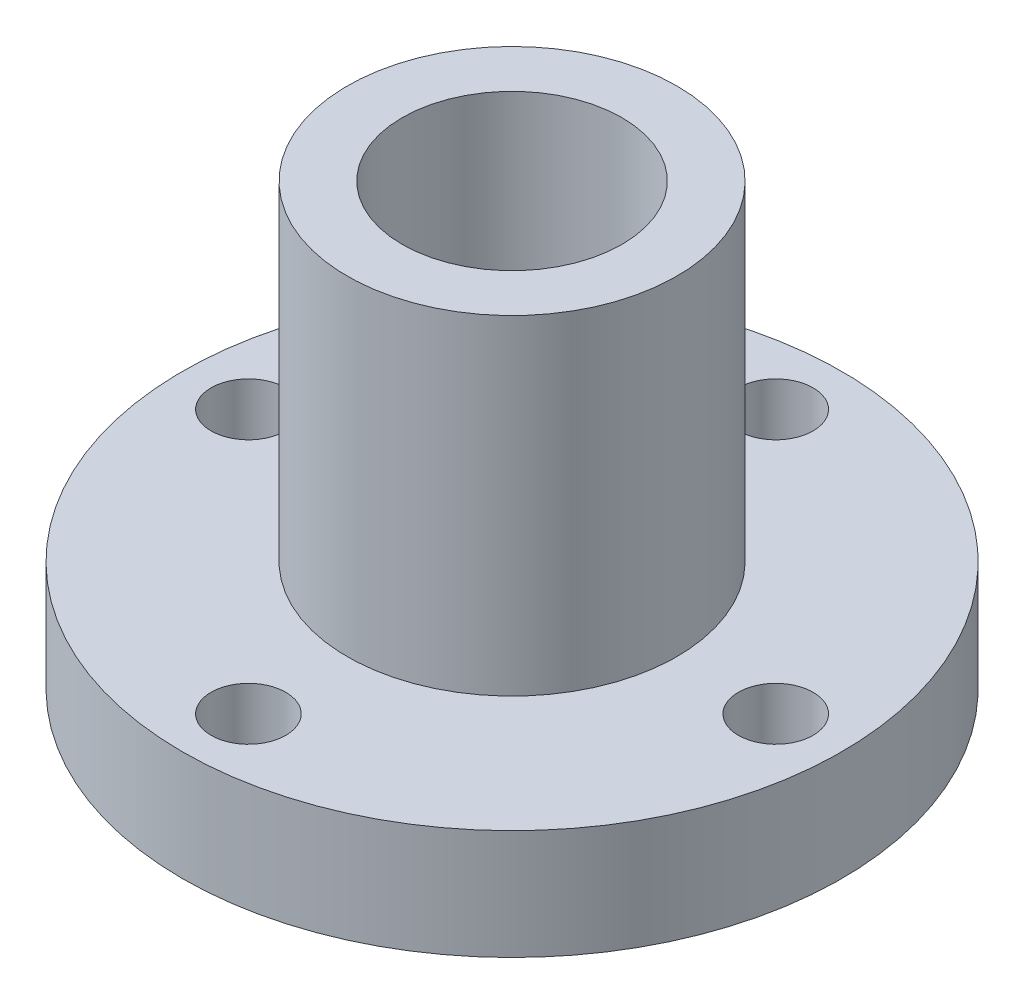
ISO-10303-21;
HEADER;
FILE_DESCRIPTION(('STEP AP214'),'2;1');
FILE_NAME('part.step','',(''),(''),'','','');
FILE_SCHEMA(('AUTOMOTIVE_DESIGN { 1 0 10303 214 1 1 1 1 }'));
ENDSEC;
DATA;
#1=APPLICATION_CONTEXT('core data for automotive mechanical design processes');
#2=APPLICATION_PROTOCOL_DEFINITION('international standard','automotive_design',2000,#1);
#3=PRODUCT_CONTEXT('',#1,'mechanical');
#4=PRODUCT('Part','Part','',(#3));
#5=PRODUCT_RELATED_PRODUCT_CATEGORY('part','',(#4));
#6=PRODUCT_DEFINITION_FORMATION('','',#4);
#7=PRODUCT_DEFINITION_CONTEXT('part definition',#1,'design');
#8=PRODUCT_DEFINITION('design','',#6,#7);
#9=PRODUCT_DEFINITION_SHAPE('','',#8);
#10=(LENGTH_UNIT() NAMED_UNIT(*) SI_UNIT(.MILLI.,.METRE.));
#11=(NAMED_UNIT(*) PLANE_ANGLE_UNIT() SI_UNIT($,.RADIAN.));
#12=(NAMED_UNIT(*) SI_UNIT($,.STERADIAN.) SOLID_ANGLE_UNIT());
#13=UNCERTAINTY_MEASURE_WITH_UNIT(LENGTH_MEASURE(1.E-05),#10,'distance_accuracy_value','');
#14=(GEOMETRIC_REPRESENTATION_CONTEXT(3) GLOBAL_UNCERTAINTY_ASSIGNED_CONTEXT((#13)) GLOBAL_UNIT_ASSIGNED_CONTEXT((#10,
#11,#12)) REPRESENTATION_CONTEXT('',''));
#15=CARTESIAN_POINT('',(0.,0.,0.));
#16=DIRECTION('',(0.,0.,1.));
#17=DIRECTION('',(1.,0.,0.));
#18=AXIS2_PLACEMENT_3D('',#15,#16,#17);
#19=CARTESIAN_POINT('',(0.,6.35,0.));
#20=DIRECTION('',(0.,1.,0.));
#21=DIRECTION('',(0.,0.,1.));
#22=AXIS2_PLACEMENT_3D('',#19,#20,#21);
#23=PLANE('',#22);
#24=CARTESIAN_POINT('',(0.,6.35,-15.24));
#25=DIRECTION('',(0.,1.,0.));
#26=DIRECTION('',(0.,0.,1.));
#27=AXIS2_PLACEMENT_3D('',#24,#25,#26);
#28=CIRCLE('',#27,2.159);
#29=CARTESIAN_POINT('',(0.,6.35,-13.081));
#30=VERTEX_POINT('',#29);
#31=EDGE_CURVE('E59',#30,#30,#28,.T.);
#32=ORIENTED_EDGE('',*,*,#31,.F.);
#33=EDGE_LOOP('',(#32));
#34=FACE_BOUND('',#33,.T.);
#35=CARTESIAN_POINT('',(15.24,6.35,0.));
#36=DIRECTION('',(0.,1.,0.));
#37=DIRECTION('',(0.,0.,1.));
#38=AXIS2_PLACEMENT_3D('',#35,#36,#37);
#39=CIRCLE('',#38,2.159);
#40=CARTESIAN_POINT('',(15.24,6.35,2.159));
#41=VERTEX_POINT('',#40);
#42=EDGE_CURVE('E113',#41,#41,#39,.T.);
#43=ORIENTED_EDGE('',*,*,#42,.F.);
#44=EDGE_LOOP('',(#43));
#45=FACE_BOUND('',#44,.T.);
#46=CARTESIAN_POINT('',(0.,6.35,15.24));
#47=DIRECTION('',(0.,1.,0.));
#48=DIRECTION('',(0.,0.,1.));
#49=AXIS2_PLACEMENT_3D('',#46,#47,#48);
#50=CIRCLE('',#49,2.159);
#51=CARTESIAN_POINT('',(0.,6.35,17.399));
#52=VERTEX_POINT('',#51);
#53=EDGE_CURVE('E117',#52,#52,#50,.T.);
#54=ORIENTED_EDGE('',*,*,#53,.F.);
#55=EDGE_LOOP('',(#54));
#56=FACE_BOUND('',#55,.T.);
#57=CARTESIAN_POINT('',(-15.24,6.35,0.));
#58=DIRECTION('',(0.,1.,0.));
#59=DIRECTION('',(0.,0.,1.));
#60=AXIS2_PLACEMENT_3D('',#57,#58,#59);
#61=CIRCLE('',#60,2.159);
#62=CARTESIAN_POINT('',(-15.24,6.35,2.159));
#63=VERTEX_POINT('',#62);
#64=EDGE_CURVE('E78',#63,#63,#61,.T.);
#65=ORIENTED_EDGE('',*,*,#64,.F.);
#66=EDGE_LOOP('',(#65));
#67=FACE_BOUND('',#66,.T.);
#68=CARTESIAN_POINT('',(0.,6.35,0.));
#69=DIRECTION('',(0.,1.,0.));
#70=DIRECTION('',(0.,0.,1.));
#71=AXIS2_PLACEMENT_3D('',#68,#69,#70);
#72=CIRCLE('',#71,19.05);
#73=CARTESIAN_POINT('',(0.,6.35,19.05));
#74=VERTEX_POINT('',#73);
#75=EDGE_CURVE('E10',#74,#74,#72,.T.);
#76=ORIENTED_EDGE('',*,*,#75,.T.);
#77=EDGE_LOOP('',(#76));
#78=FACE_BOUND('',#77,.T.);
#79=CARTESIAN_POINT('',(0.,6.35,0.));
#80=DIRECTION('',(0.,1.,0.));
#81=DIRECTION('',(0.,0.,1.));
#82=AXIS2_PLACEMENT_3D('',#79,#80,#81);
#83=CIRCLE('',#82,9.525);
#84=CARTESIAN_POINT('',(0.,6.35,-9.525));
#85=VERTEX_POINT('',#84);
#86=EDGE_CURVE('E70',#85,#85,#83,.T.);
#87=ORIENTED_EDGE('',*,*,#86,.F.);
#88=EDGE_LOOP('',(#87));
#89=FACE_BOUND('',#88,.T.);
#90=ADVANCED_FACE('F37',(#34,#45,#56,#67,#78,#89),#23,.T.);
#91=CARTESIAN_POINT('',(0.,0.,0.));
#92=DIRECTION('',(0.,1.,0.));
#93=DIRECTION('',(0.,0.,1.));
#94=AXIS2_PLACEMENT_3D('',#91,#92,#93);
#95=PLANE('',#94);
#96=CARTESIAN_POINT('',(0.,0.,-15.24));
#97=DIRECTION('',(0.,1.,0.));
#98=DIRECTION('',(0.,0.,1.));
#99=AXIS2_PLACEMENT_3D('',#96,#97,#98);
#100=CIRCLE('',#99,2.159);
#101=CARTESIAN_POINT('',(0.,0.,-13.081));
#102=VERTEX_POINT('',#101);
#103=EDGE_CURVE('E41',#102,#102,#100,.T.);
#104=ORIENTED_EDGE('',*,*,#103,.T.);
#105=EDGE_LOOP('',(#104));
#106=FACE_BOUND('',#105,.T.);
#107=CARTESIAN_POINT('',(15.24,0.,0.));
#108=DIRECTION('',(0.,1.,0.));
#109=DIRECTION('',(0.,0.,1.));
#110=AXIS2_PLACEMENT_3D('',#107,#108,#109);
#111=CIRCLE('',#110,2.159);
#112=CARTESIAN_POINT('',(15.24,0.,2.159));
#113=VERTEX_POINT('',#112);
#114=EDGE_CURVE('E61',#113,#113,#111,.T.);
#115=ORIENTED_EDGE('',*,*,#114,.T.);
#116=EDGE_LOOP('',(#115));
#117=FACE_BOUND('',#116,.T.);
#118=CARTESIAN_POINT('',(0.,0.,15.24));
#119=DIRECTION('',(0.,1.,0.));
#120=DIRECTION('',(0.,0.,1.));
#121=AXIS2_PLACEMENT_3D('',#118,#119,#120);
#122=CIRCLE('',#121,2.159);
#123=CARTESIAN_POINT('',(0.,0.,17.399));
#124=VERTEX_POINT('',#123);
#125=EDGE_CURVE('E58',#124,#124,#122,.T.);
#126=ORIENTED_EDGE('',*,*,#125,.T.);
#127=EDGE_LOOP('',(#126));
#128=FACE_BOUND('',#127,.T.);
#129=CARTESIAN_POINT('',(-15.24,0.,0.));
#130=DIRECTION('',(0.,1.,0.));
#131=DIRECTION('',(0.,0.,1.));
#132=AXIS2_PLACEMENT_3D('',#129,#130,#131);
#133=CIRCLE('',#132,2.159);
#134=CARTESIAN_POINT('',(-15.24,0.,2.159));
#135=VERTEX_POINT('',#134);
#136=EDGE_CURVE('E55',#135,#135,#133,.T.);
#137=ORIENTED_EDGE('',*,*,#136,.T.);
#138=EDGE_LOOP('',(#137));
#139=FACE_BOUND('',#138,.T.);
#140=CARTESIAN_POINT('',(0.,0.,0.));
#141=DIRECTION('',(0.,1.,0.));
#142=DIRECTION('',(0.,0.,1.));
#143=AXIS2_PLACEMENT_3D('',#140,#141,#142);
#144=CIRCLE('',#143,19.05);
#145=CARTESIAN_POINT('',(0.,0.,19.05));
#146=VERTEX_POINT('',#145);
#147=EDGE_CURVE('E45',#146,#146,#144,.T.);
#148=ORIENTED_EDGE('',*,*,#147,.F.);
#149=EDGE_LOOP('',(#148));
#150=FACE_BOUND('',#149,.T.);
#151=CARTESIAN_POINT('',(0.,0.,0.));
#152=DIRECTION('',(0.,1.,0.));
#153=DIRECTION('',(0.,0.,1.));
#154=AXIS2_PLACEMENT_3D('',#151,#152,#153);
#155=CIRCLE('',#154,6.35);
#156=CARTESIAN_POINT('',(0.,0.,6.35));
#157=VERTEX_POINT('',#156);
#158=EDGE_CURVE('E50',#157,#157,#155,.T.);
#159=ORIENTED_EDGE('',*,*,#158,.T.);
#160=EDGE_LOOP('',(#159));
#161=FACE_BOUND('',#160,.T.);
#162=ADVANCED_FACE('F86',(#106,#117,#128,#139,#150,#161),#95,.F.);
#163=CARTESIAN_POINT('',(0.,6.35,0.));
#164=DIRECTION('',(0.,-1.,0.));
#165=DIRECTION('',(0.,0.,-1.));
#166=AXIS2_PLACEMENT_3D('',#163,#164,#165);
#167=CYLINDRICAL_SURFACE('',#166,19.05);
#168=ORIENTED_EDGE('',*,*,#75,.F.);
#169=EDGE_LOOP('',(#168));
#170=FACE_BOUND('',#169,.T.);
#171=ORIENTED_EDGE('',*,*,#147,.T.);
#172=EDGE_LOOP('',(#171));
#173=FACE_BOUND('',#172,.T.);
#174=ADVANCED_FACE('F39',(#170,#173),#167,.T.);
#175=CARTESIAN_POINT('',(0.,6.35,0.));
#176=DIRECTION('',(0.,-1.,0.));
#177=DIRECTION('',(0.,0.,-1.));
#178=AXIS2_PLACEMENT_3D('',#175,#176,#177);
#179=CYLINDRICAL_SURFACE('',#178,6.35);
#180=ORIENTED_EDGE('',*,*,#158,.F.);
#181=EDGE_LOOP('',(#180));
#182=FACE_BOUND('',#181,.T.);
#183=CARTESIAN_POINT('',(0.,25.4,0.));
#184=DIRECTION('',(0.,1.,0.));
#185=DIRECTION('',(0.,0.,1.));
#186=AXIS2_PLACEMENT_3D('',#183,#184,#185);
#187=CIRCLE('',#186,6.35);
#188=CARTESIAN_POINT('',(0.,25.4,6.35));
#189=VERTEX_POINT('',#188);
#190=EDGE_CURVE('E66',#189,#189,#187,.T.);
#191=ORIENTED_EDGE('',*,*,#190,.T.);
#192=EDGE_LOOP('',(#191));
#193=FACE_BOUND('',#192,.T.);
#194=ADVANCED_FACE('F88',(#182,#193),#179,.F.);
#195=CARTESIAN_POINT('',(0.,25.4,0.));
#196=DIRECTION('',(0.,1.,0.));
#197=DIRECTION('',(0.,0.,1.));
#198=AXIS2_PLACEMENT_3D('',#195,#196,#197);
#199=PLANE('',#198);
#200=CARTESIAN_POINT('',(0.,25.4,0.));
#201=DIRECTION('',(0.,1.,0.));
#202=DIRECTION('',(0.,0.,1.));
#203=AXIS2_PLACEMENT_3D('',#200,#201,#202);
#204=CIRCLE('',#203,9.525);
#205=CARTESIAN_POINT('',(0.,25.4,-9.525));
#206=VERTEX_POINT('',#205);
#207=EDGE_CURVE('E75',#206,#206,#204,.T.);
#208=ORIENTED_EDGE('',*,*,#207,.T.);
#209=EDGE_LOOP('',(#208));
#210=FACE_BOUND('',#209,.T.);
#211=ORIENTED_EDGE('',*,*,#190,.F.);
#212=EDGE_LOOP('',(#211));
#213=FACE_BOUND('',#212,.T.);
#214=ADVANCED_FACE('F90',(#210,#213),#199,.T.);
#215=CARTESIAN_POINT('',(0.,25.4,0.));
#216=DIRECTION('',(0.,-1.,0.));
#217=DIRECTION('',(0.,0.,-1.));
#218=AXIS2_PLACEMENT_3D('',#215,#216,#217);
#219=CYLINDRICAL_SURFACE('',#218,9.525);
#220=CARTESIAN_POINT('',(0.,25.4,-9.525));
#221=CARTESIAN_POINT('',(0.,25.2015625,-9.525));
#222=CARTESIAN_POINT('',(0.,25.003125,-9.525));
#223=CARTESIAN_POINT('',(0.,24.60625,-9.525));
#224=CARTESIAN_POINT('',(0.,24.4078125,-9.525));
#225=CARTESIAN_POINT('',(0.,24.0109375,-9.525));
#226=CARTESIAN_POINT('',(0.,23.8125,-9.525));
#227=CARTESIAN_POINT('',(0.,23.415625,-9.525));
#228=CARTESIAN_POINT('',(0.,23.2171875,-9.525));
#229=CARTESIAN_POINT('',(0.,22.8203125,-9.525));
#230=CARTESIAN_POINT('',(0.,22.621875,-9.525));
#231=CARTESIAN_POINT('',(0.,22.225,-9.525));
#232=CARTESIAN_POINT('',(0.,22.0265625,-9.525));
#233=CARTESIAN_POINT('',(0.,21.6296875,-9.525));
#234=CARTESIAN_POINT('',(0.,21.43125,-9.525));
#235=CARTESIAN_POINT('',(0.,21.034375,-9.525));
#236=CARTESIAN_POINT('',(0.,20.8359375,-9.525));
#237=CARTESIAN_POINT('',(0.,20.4390625,-9.525));
#238=CARTESIAN_POINT('',(0.,20.240625,-9.525));
#239=CARTESIAN_POINT('',(0.,19.84375,-9.525));
#240=CARTESIAN_POINT('',(0.,19.6453125,-9.525));
#241=CARTESIAN_POINT('',(0.,19.2484375,-9.525));
#242=CARTESIAN_POINT('',(0.,19.05,-9.525));
#243=CARTESIAN_POINT('',(0.,18.653125,-9.525));
#244=CARTESIAN_POINT('',(0.,18.4546875,-9.525));
#245=CARTESIAN_POINT('',(0.,18.0578125,-9.525));
#246=CARTESIAN_POINT('',(0.,17.859375,-9.525));
#247=CARTESIAN_POINT('',(0.,17.4625,-9.525));
#248=CARTESIAN_POINT('',(0.,17.2640625,-9.525));
#249=CARTESIAN_POINT('',(0.,16.8671875,-9.525));
#250=CARTESIAN_POINT('',(0.,16.66875,-9.525));
#251=CARTESIAN_POINT('',(0.,16.271875,-9.525));
#252=CARTESIAN_POINT('',(0.,16.0734375,-9.525));
#253=CARTESIAN_POINT('',(0.,15.6765625,-9.525));
#254=CARTESIAN_POINT('',(0.,15.478125,-9.525));
#255=CARTESIAN_POINT('',(0.,15.08125,-9.525));
#256=CARTESIAN_POINT('',(0.,14.8828125,-9.525));
#257=CARTESIAN_POINT('',(0.,14.4859375,-9.525));
#258=CARTESIAN_POINT('',(0.,14.2875,-9.525));
#259=CARTESIAN_POINT('',(0.,13.890625,-9.525));
#260=CARTESIAN_POINT('',(0.,13.6921875,-9.525));
#261=CARTESIAN_POINT('',(0.,13.2953125,-9.525));
#262=CARTESIAN_POINT('',(0.,13.096875,-9.525));
#263=CARTESIAN_POINT('',(0.,12.7,-9.525));
#264=CARTESIAN_POINT('',(0.,12.5015625,-9.525));
#265=CARTESIAN_POINT('',(0.,12.1046875,-9.525));
#266=CARTESIAN_POINT('',(0.,11.90625,-9.525));
#267=CARTESIAN_POINT('',(0.,11.509375,-9.525));
#268=CARTESIAN_POINT('',(0.,11.3109375,-9.525));
#269=CARTESIAN_POINT('',(0.,10.9140625,-9.525));
#270=CARTESIAN_POINT('',(0.,10.715625,-9.525));
#271=CARTESIAN_POINT('',(0.,10.31875,-9.525));
#272=CARTESIAN_POINT('',(0.,10.1203125,-9.525));
#273=CARTESIAN_POINT('',(0.,9.7234375,-9.525));
#274=CARTESIAN_POINT('',(0.,9.525,-9.525));
#275=CARTESIAN_POINT('',(0.,9.128125,-9.525));
#276=CARTESIAN_POINT('',(0.,8.9296875,-9.525));
#277=CARTESIAN_POINT('',(0.,8.5328125,-9.525));
#278=CARTESIAN_POINT('',(0.,8.334375,-9.525));
#279=CARTESIAN_POINT('',(0.,7.9375,-9.525));
#280=CARTESIAN_POINT('',(0.,7.7390625,-9.525));
#281=CARTESIAN_POINT('',(0.,7.3421875,-9.525));
#282=CARTESIAN_POINT('',(0.,7.14375,-9.525));
#283=CARTESIAN_POINT('',(0.,6.746875,-9.525));
#284=CARTESIAN_POINT('',(0.,6.5484375,-9.525));
#285=CARTESIAN_POINT('',(0.,6.35,-9.525));
#286=B_SPLINE_CURVE_WITH_KNOTS('',3,(#220,#221,#222,#223,#224,#225,#226,#227,#228,#229,#230,
#231,#232,#233,#234,#235,#236,#237,#238,#239,#240,#241,#242,#243,#244,#245,#246,#247,#248,#249,
#250,#251,#252,#253,#254,#255,#256,#257,#258,#259,#260,#261,#262,#263,#264,#265,#266,#267,#268,
#269,#270,#271,#272,#273,#274,#275,#276,#277,#278,#279,#280,#281,#282,#283,#284,#285),
.UNSPECIFIED.,.F.,.F.,(4,2,2,2,2,2,2,2,2,2,2,2,2,2,2,2,2,2,2,2,2,2,2,2,2,2,2,2,2,2,2,2,4),(0.,
0.5953125,1.190625,1.7859375,2.38125,2.9765625,3.571875,4.1671875,4.7625,5.3578125,5.953125,
6.5484375,7.14375,7.7390625,8.334375,8.9296875,9.525,10.1203125,10.715625,11.3109375,11.90625,
12.5015625,13.096875,13.6921875,14.2875,14.8828125,15.478125,16.0734375,16.66875,17.2640625,
17.859375,18.4546875,19.05),.UNSPECIFIED.);
#287=EDGE_CURVE('BSEAM96',#206,#85,#286,.T.);
#288=ORIENTED_EDGE('',*,*,#207,.F.);
#289=ORIENTED_EDGE('',*,*,#86,.T.);
#290=ORIENTED_EDGE('',*,*,#287,.T.);
#291=ORIENTED_EDGE('',*,*,#287,.F.);
#292=EDGE_LOOP('',(#288,#290,#289,#291));
#293=FACE_BOUND('',#292,.T.);
#294=ADVANCED_FACE('F96',(#293),#219,.T.);
#295=CARTESIAN_POINT('',(-15.24,-5.588,0.));
#296=DIRECTION('',(0.,1.,0.));
#297=DIRECTION('',(0.,0.,1.));
#298=AXIS2_PLACEMENT_3D('',#295,#296,#297);
#299=CYLINDRICAL_SURFACE('',#298,2.159);
#300=ORIENTED_EDGE('',*,*,#64,.T.);
#301=EDGE_LOOP('',(#300));
#302=FACE_BOUND('',#301,.T.);
#303=ORIENTED_EDGE('',*,*,#136,.F.);
#304=EDGE_LOOP('',(#303));
#305=FACE_BOUND('',#304,.T.);
#306=ADVANCED_FACE('F123',(#302,#305),#299,.F.);
#307=CARTESIAN_POINT('',(0.,-5.588,15.24));
#308=DIRECTION('',(0.,1.,0.));
#309=DIRECTION('',(0.,0.,1.));
#310=AXIS2_PLACEMENT_3D('',#307,#308,#309);
#311=CYLINDRICAL_SURFACE('',#310,2.159);
#312=ORIENTED_EDGE('',*,*,#53,.T.);
#313=EDGE_LOOP('',(#312));
#314=FACE_BOUND('',#313,.T.);
#315=ORIENTED_EDGE('',*,*,#125,.F.);
#316=EDGE_LOOP('',(#315));
#317=FACE_BOUND('',#316,.T.);
#318=ADVANCED_FACE('F128',(#314,#317),#311,.F.);
#319=CARTESIAN_POINT('',(15.24,-5.588,0.));
#320=DIRECTION('',(0.,1.,0.));
#321=DIRECTION('',(0.,0.,1.));
#322=AXIS2_PLACEMENT_3D('',#319,#320,#321);
#323=CYLINDRICAL_SURFACE('',#322,2.159);
#324=ORIENTED_EDGE('',*,*,#42,.T.);
#325=EDGE_LOOP('',(#324));
#326=FACE_BOUND('',#325,.T.);
#327=ORIENTED_EDGE('',*,*,#114,.F.);
#328=EDGE_LOOP('',(#327));
#329=FACE_BOUND('',#328,.T.);
#330=ADVANCED_FACE('F134',(#326,#329),#323,.F.);
#331=CARTESIAN_POINT('',(0.,-5.588,-15.24));
#332=DIRECTION('',(0.,1.,0.));
#333=DIRECTION('',(0.,0.,1.));
#334=AXIS2_PLACEMENT_3D('',#331,#332,#333);
#335=CYLINDRICAL_SURFACE('',#334,2.159);
#336=ORIENTED_EDGE('',*,*,#31,.T.);
#337=EDGE_LOOP('',(#336));
#338=FACE_BOUND('',#337,.T.);
#339=ORIENTED_EDGE('',*,*,#103,.F.);
#340=EDGE_LOOP('',(#339));
#341=FACE_BOUND('',#340,.T.);
#342=ADVANCED_FACE('F138',(#338,#341),#335,.F.);
#343=CLOSED_SHELL('',(#90,#162,#174,#194,#214,#294,#306,#318,#330,#342));
#344=MANIFOLD_SOLID_BREP('B2',#343);
#345=ADVANCED_BREP_SHAPE_REPRESENTATION('',(#18,#344),#14);
#346=SHAPE_DEFINITION_REPRESENTATION(#9,#345);
ENDSEC;
END-ISO-10303-21;
